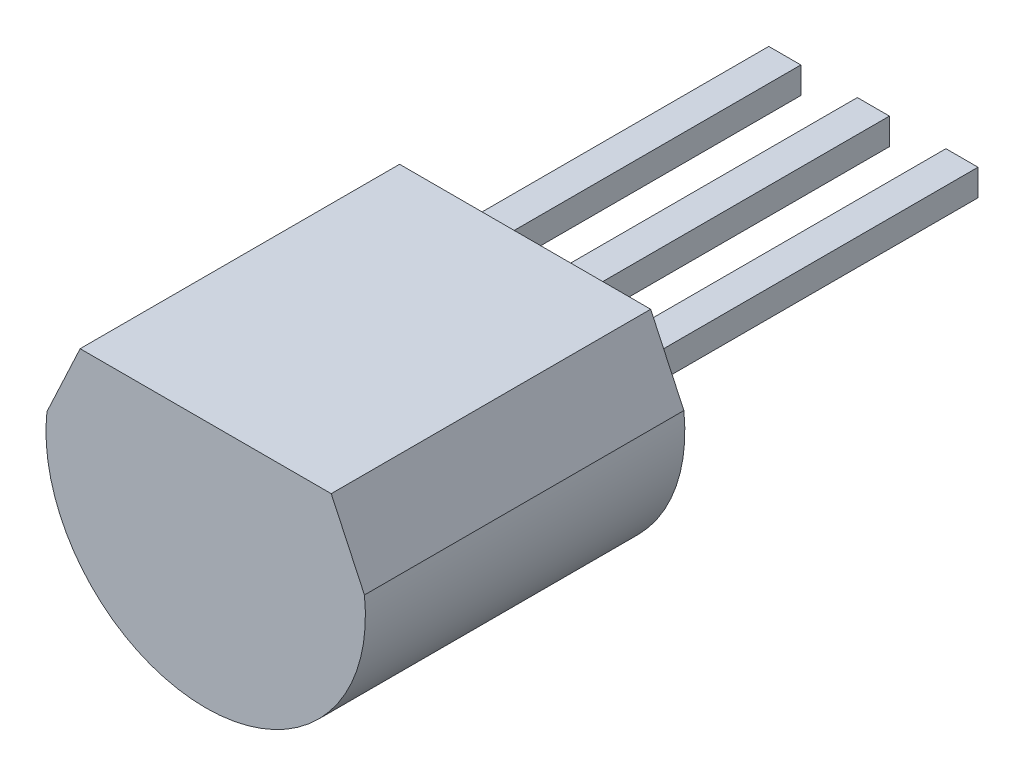
ISO-10303-21;
HEADER;
FILE_DESCRIPTION(('STEP AP214'),'2;1');
FILE_NAME('part.step','',(''),(''),'','','');
FILE_SCHEMA(('AUTOMOTIVE_DESIGN { 1 0 10303 214 1 1 1 1 }'));
ENDSEC;
DATA;
#1=APPLICATION_CONTEXT('core data for automotive mechanical design processes');
#2=APPLICATION_PROTOCOL_DEFINITION('international standard','automotive_design',2000,#1);
#3=PRODUCT_CONTEXT('',#1,'mechanical');
#4=PRODUCT('Part','Part','',(#3));
#5=PRODUCT_RELATED_PRODUCT_CATEGORY('part','',(#4));
#6=PRODUCT_DEFINITION_FORMATION('','',#4);
#7=PRODUCT_DEFINITION_CONTEXT('part definition',#1,'design');
#8=PRODUCT_DEFINITION('design','',#6,#7);
#9=PRODUCT_DEFINITION_SHAPE('','',#8);
#10=(LENGTH_UNIT() NAMED_UNIT(*) SI_UNIT(.MILLI.,.METRE.));
#11=(NAMED_UNIT(*) PLANE_ANGLE_UNIT() SI_UNIT($,.RADIAN.));
#12=(NAMED_UNIT(*) SI_UNIT($,.STERADIAN.) SOLID_ANGLE_UNIT());
#13=UNCERTAINTY_MEASURE_WITH_UNIT(LENGTH_MEASURE(1.E-05),#10,'distance_accuracy_value','');
#14=(GEOMETRIC_REPRESENTATION_CONTEXT(3) GLOBAL_UNCERTAINTY_ASSIGNED_CONTEXT((#13)) GLOBAL_UNIT_ASSIGNED_CONTEXT((#10,
#11,#12)) REPRESENTATION_CONTEXT('',''));
#15=CARTESIAN_POINT('',(0.,0.,0.));
#16=DIRECTION('',(0.,0.,1.));
#17=DIRECTION('',(1.,0.,0.));
#18=AXIS2_PLACEMENT_3D('',#15,#16,#17);
#19=CARTESIAN_POINT('',(0.,0.,4.58));
#20=DIRECTION('',(0.,0.,-1.));
#21=DIRECTION('',(-1.,0.,0.));
#22=AXIS2_PLACEMENT_3D('',#19,#20,#21);
#23=CYLINDRICAL_SURFACE('',#22,2.29);
#24=CARTESIAN_POINT('',(0.,0.,0.));
#25=DIRECTION('',(0.,0.,1.));
#26=DIRECTION('',(1.,0.,0.));
#27=AXIS2_PLACEMENT_3D('',#24,#25,#26);
#28=CIRCLE('',#27,2.29);
#29=CARTESIAN_POINT('',(-2.27631280802969,0.249999999999999,0.));
#30=VERTEX_POINT('',#29);
#31=CARTESIAN_POINT('',(2.27631280802969,0.25,0.));
#32=VERTEX_POINT('',#31);
#33=EDGE_CURVE('E259',#30,#32,#28,.T.);
#34=ORIENTED_EDGE('',*,*,#33,.T.);
#35=DIRECTION('',(0.,0.,-1.));
#36=VECTOR('',#35,1.);
#37=CARTESIAN_POINT('',(2.27631280802969,0.25,4.58));
#38=LINE('',#37,#36);
#39=CARTESIAN_POINT('',(2.27631280802969,0.25,4.58));
#40=VERTEX_POINT('',#39);
#41=EDGE_CURVE('E270',#40,#32,#38,.T.);
#42=ORIENTED_EDGE('',*,*,#41,.F.);
#43=CARTESIAN_POINT('',(0.,0.,4.58));
#44=DIRECTION('',(0.,0.,1.));
#45=DIRECTION('',(1.,0.,0.));
#46=AXIS2_PLACEMENT_3D('',#43,#44,#45);
#47=CIRCLE('',#46,2.29);
#48=CARTESIAN_POINT('',(-2.27631280802969,0.249999999999999,4.58));
#49=VERTEX_POINT('',#48);
#50=EDGE_CURVE('E247',#49,#40,#47,.T.);
#51=ORIENTED_EDGE('',*,*,#50,.F.);
#52=DIRECTION('',(0.,0.,-1.));
#53=VECTOR('',#52,1.);
#54=CARTESIAN_POINT('',(-2.27631280802969,0.249999999999999,4.58));
#55=LINE('',#54,#53);
#56=EDGE_CURVE('E46',#49,#30,#55,.T.);
#57=ORIENTED_EDGE('',*,*,#56,.T.);
#58=EDGE_LOOP('',(#34,#42,#51,#57));
#59=FACE_BOUND('',#58,.T.);
#60=CARTESIAN_POINT('',(0.,-2.29,1.62090682402154));
#61=CARTESIAN_POINT('',(0.0330975023179404,-2.28999948140746,1.62090765252265));
#62=CARTESIAN_POINT('',(0.0662039858905826,-2.28927537337162,1.62365462650305));
#63=CARTESIAN_POINT('',(0.131464637050143,-2.28645703985818,1.63455135152726));
#64=CARTESIAN_POINT('',(0.163618314571738,-2.28436212167969,1.64270383412264));
#65=CARTESIAN_POINT('',(0.226021796698901,-2.27903360778137,1.66412938002197));
#66=CARTESIAN_POINT('',(0.256273952267468,-2.27580145208567,1.67739596962239));
#67=CARTESIAN_POINT('',(0.314123739260772,-2.26854079665533,1.70864948722007));
#68=CARTESIAN_POINT('',(0.341721218210251,-2.26451225121942,1.72663668613152));
#69=CARTESIAN_POINT('',(0.394097829725334,-2.25599332271291,1.76724723631969));
#70=CARTESIAN_POINT('',(0.418808871599396,-2.2514952619971,1.78995679817719));
#71=CARTESIAN_POINT('',(0.464118822250609,-2.24259404374079,1.83918306077215));
#72=CARTESIAN_POINT('',(0.484717220830887,-2.23819089803541,1.86570023316479));
#73=CARTESIAN_POINT('',(0.521545803022261,-2.22989984201811,1.92232826555429));
#74=CARTESIAN_POINT('',(0.537698272364809,-2.22602163587792,1.95249121868668));
#75=CARTESIAN_POINT('',(0.564676155228551,-2.21933218837529,2.01522262807281));
#76=CARTESIAN_POINT('',(0.575502513337967,-2.21652075783996,2.04779065660614));
#77=CARTESIAN_POINT('',(0.591285570306814,-2.21236234868324,2.11365514294817));
#78=CARTESIAN_POINT('',(0.596365432745851,-2.21098469407197,2.14692010385428));
#79=CARTESIAN_POINT('',(0.600895183733747,-2.20975811935859,2.21385641456427));
#80=CARTESIAN_POINT('',(0.60034608497926,-2.20990892427391,2.24752769018006));
#81=CARTESIAN_POINT('',(0.593731418754882,-2.21169474042252,2.3133645081738));
#82=CARTESIAN_POINT('',(0.587814229338992,-2.21328982832024,2.34554621244983));
#83=CARTESIAN_POINT('',(0.570868723925989,-2.21772064514648,2.40844336972707));
#84=CARTESIAN_POINT('',(0.559840012062657,-2.22055647016398,2.43915870896112));
#85=CARTESIAN_POINT('',(0.532862047434301,-2.22718477786126,2.49864116845925));
#86=CARTESIAN_POINT('',(0.516860256013678,-2.23098739230707,2.52738328346402));
#87=CARTESIAN_POINT('',(0.480427042276187,-2.23911529607005,2.58182683207981));
#88=CARTESIAN_POINT('',(0.459994775391239,-2.24344068497243,2.60752768449829));
#89=CARTESIAN_POINT('',(0.414519107364714,-2.25229350521695,2.65600763973622));
#90=CARTESIAN_POINT('',(0.389350928758984,-2.2568230132373,2.67866947791652));
#91=CARTESIAN_POINT('',(0.335516376401778,-2.26545156820925,2.71947433796078));
#92=CARTESIAN_POINT('',(0.306849874125196,-2.26955059933525,2.73761719372708));
#93=CARTESIAN_POINT('',(0.246654899784228,-2.27688014033064,2.76891824032964));
#94=CARTESIAN_POINT('',(0.215115248743747,-2.28010704549129,2.78205583207798));
#95=CARTESIAN_POINT('',(0.150171298595141,-2.28530265564173,2.80280888156858));
#96=CARTESIAN_POINT('',(0.116767393983039,-2.28727162573459,2.8104255028713));
#97=CARTESIAN_POINT('',(0.0500444306683029,-2.28968966995334,2.81973772244365));
#98=CARTESIAN_POINT('',(0.0167490831546127,-2.29017967705413,2.8215928243885));
#99=CARTESIAN_POINT('',(-0.0496767829065809,-2.28970195532964,2.81976897468164));
#100=CARTESIAN_POINT('',(-0.0828073175285915,-2.28873437157793,2.81609057377781));
#101=CARTESIAN_POINT('',(-0.147398100625419,-2.28547656809237,2.80343515824928));
#102=CARTESIAN_POINT('',(-0.178876887011537,-2.28320843053068,2.79454655320458));
#103=CARTESIAN_POINT('',(-0.239893936814223,-2.27760629903843,2.77182522903229));
#104=CARTESIAN_POINT('',(-0.269431993380646,-2.27427219171432,2.75799198389542));
#105=CARTESIAN_POINT('',(-0.326353126142149,-2.26681142532615,2.72547442681036));
#106=CARTESIAN_POINT('',(-0.353684345322917,-2.26267086082751,2.70670260988338));
#107=CARTESIAN_POINT('',(-0.40486498635958,-2.25407607828748,2.66495129947086));
#108=CARTESIAN_POINT('',(-0.428713743655181,-2.24962180061978,2.6419710047601));
#109=CARTESIAN_POINT('',(-0.472920419527273,-2.24075193147354,2.59171171399555));
#110=CARTESIAN_POINT('',(-0.493165974764859,-2.23634067411957,2.56433294264012));
#111=CARTESIAN_POINT('',(-0.528777008579864,-2.22818982070887,2.50647397946217));
#112=CARTESIAN_POINT('',(-0.544142695775825,-2.22445019594225,2.47599392029595));
#113=CARTESIAN_POINT('',(-0.569442167718115,-2.21810861000545,2.41295370780964));
#114=CARTESIAN_POINT('',(-0.579407731184882,-2.21550001152819,2.38040701146252));
#115=CARTESIAN_POINT('',(-0.593701962572269,-2.21171284209218,2.31402026788187));
#116=CARTESIAN_POINT('',(-0.598032010586037,-2.21053392102156,2.28018053939202));
#117=CARTESIAN_POINT('',(-0.600854951654086,-2.2097681130648,2.21331665694947));
#118=CARTESIAN_POINT('',(-0.599528144780679,-2.21013204880956,2.18030056225179));
#119=CARTESIAN_POINT('',(-0.5914916777254,-2.21229621930244,2.11498055560863));
#120=CARTESIAN_POINT('',(-0.584782147082776,-2.21409641948578,2.08267662654358));
#121=CARTESIAN_POINT('',(-0.5662735320344,-2.21890153260919,2.01991604014583));
#122=CARTESIAN_POINT('',(-0.554511401451611,-2.22189768749868,1.98944776743062));
#123=CARTESIAN_POINT('',(-0.52626028637817,-2.22875760801448,1.93089434840107));
#124=CARTESIAN_POINT('',(-0.509770584233331,-2.23262150534642,1.90280956474434));
#125=CARTESIAN_POINT('',(-0.471980614788332,-2.2409190185835,1.84895666854931));
#126=CARTESIAN_POINT('',(-0.450556715572077,-2.24536572620597,1.82327731667711));
#127=CARTESIAN_POINT('',(-0.403743283365995,-2.2542533144814,1.77581958659294));
#128=CARTESIAN_POINT('',(-0.378352794457848,-2.25869419346889,1.75404215143669));
#129=CARTESIAN_POINT('',(-0.323700796482316,-2.26717821173752,1.71456996756139));
#130=CARTESIAN_POINT('',(-0.294370787761282,-2.27121136912249,1.69696773931732));
#131=CARTESIAN_POINT('',(-0.233063712672143,-2.27831749136788,1.66697168156432));
#132=CARTESIAN_POINT('',(-0.201088419000533,-2.28139109277109,1.65457439734946));
#133=CARTESIAN_POINT('',(-0.141011367797884,-2.28581795268001,1.63702132472103));
#134=CARTESIAN_POINT('',(-0.113176640303292,-2.2873749815978,1.63099213965557));
#135=CARTESIAN_POINT('',(-0.0568967834025167,-2.28946618132238,1.62293471639974));
#136=CARTESIAN_POINT('',(-0.0284517101363374,-2.29000044579933,1.62090611181453));
#137=CARTESIAN_POINT('',(0.,-2.29,1.62090682402154));
#138=B_SPLINE_CURVE_WITH_KNOTS('',3,(#60,#61,#62,#63,#64,#65,#66,#67,#68,#69,#70,#71,#72,#73,
#74,#75,#76,#77,#78,#79,#80,#81,#82,#83,#84,#85,#86,#87,#88,#89,#90,#91,#92,#93,#94,#95,#96,#97,
#98,#99,#100,#101,#102,#103,#104,#105,#106,#107,#108,#109,#110,#111,#112,#113,#114,#115,#116,
#117,#118,#119,#120,#121,#122,#123,#124,#125,#126,#127,#128,#129,#130,#131,#132,#133,#134,#135,
#136,#137),.UNSPECIFIED.,.T.,.F.,(4,2,2,2,2,2,2,2,2,2,2,2,2,2,2,2,2,2,2,2,2,2,2,2,2,2,2,2,2,2,2,
2,2,2,2,2,2,2,4),(0.,0.0991881887198287,0.198426538187172,0.297539676910804,0.396658504948574,
0.497776993180304,0.59890801795395,0.701708321820208,0.804490387427924,0.905025136005533,
1.00554179786822,1.1033620339432,1.20118984705608,1.30008847962859,1.39900598154702,
1.50103345446978,1.60306467691455,1.70551138445841,1.80793649478011,1.90749954635346,
2.00705268910153,2.1049635538176,2.20288483736249,2.30267406414397,2.40248230894692,
2.50500050634471,2.60751432041148,2.70941812094822,2.81129696135183,2.90995332115767,
3.00860730679612,3.10655172155596,3.20451101234037,3.30526023406536,3.40603377315727,
3.50886655376676,3.61163097229573,3.69690423744294,3.78216969243998),.UNSPECIFIED.);
#139=CARTESIAN_POINT('',(0.,-2.29,1.62090682402154));
#140=VERTEX_POINT('',#139);
#141=EDGE_CURVE('E11',#140,#140,#138,.T.);
#142=ORIENTED_EDGE('',*,*,#141,.F.);
#143=EDGE_LOOP('',(#142));
#144=FACE_BOUND('',#143,.T.);
#145=ADVANCED_FACE('F35',(#59,#144),#23,.T.);
#146=CARTESIAN_POINT('',(0.,-5.16343310267592,0.));
#147=DIRECTION('',(0.,0.,1.));
#148=DIRECTION('',(1.,0.,0.));
#149=AXIS2_PLACEMENT_3D('',#146,#147,#148);
#150=PLANE('',#149);
#151=DIRECTION('',(-1.,0.,0.));
#152=VECTOR('',#151,1.);
#153=CARTESIAN_POINT('',(1.49328132172173,0.,0.));
#154=LINE('',#153,#152);
#155=CARTESIAN_POINT('',(1.49328132172173,0.,0.));
#156=VERTEX_POINT('',#155);
#157=CARTESIAN_POINT('',(1.03328132171853,0.,0.));
#158=VERTEX_POINT('',#157);
#159=EDGE_CURVE('E172',#156,#158,#154,.T.);
#160=ORIENTED_EDGE('',*,*,#159,.F.);
#161=DIRECTION('',(4.21640518552389E-12,-1.,0.));
#162=VECTOR('',#161,1.);
#163=CARTESIAN_POINT('',(1.49328132172013,0.379999999999991,0.));
#164=LINE('',#163,#162);
#165=CARTESIAN_POINT('',(1.49328132172013,0.379999999999991,0.));
#166=VERTEX_POINT('',#165);
#167=EDGE_CURVE('E185',#166,#156,#164,.T.);
#168=ORIENTED_EDGE('',*,*,#167,.F.);
#169=DIRECTION('',(1.,0.,0.));
#170=VECTOR('',#169,1.);
#171=CARTESIAN_POINT('',(1.49328132172013,0.379999999999991,0.));
#172=LINE('',#171,#170);
#173=CARTESIAN_POINT('',(1.03328132172013,0.379999999999991,0.));
#174=VERTEX_POINT('',#173);
#175=EDGE_CURVE('E194',#174,#166,#172,.T.);
#176=ORIENTED_EDGE('',*,*,#175,.F.);
#177=DIRECTION('',(4.21640518552389E-12,1.,0.));
#178=VECTOR('',#177,1.);
#179=CARTESIAN_POINT('',(1.03328132172013,0.379999999999991,0.));
#180=LINE('',#179,#178);
#181=EDGE_CURVE('E175',#158,#174,#180,.T.);
#182=ORIENTED_EDGE('',*,*,#181,.F.);
#183=EDGE_LOOP('',(#160,#168,#176,#182));
#184=FACE_BOUND('',#183,.T.);
#185=DIRECTION('',(-0.423113630363178,-0.90607662799616,0.));
#186=VECTOR('',#185,1.);
#187=CARTESIAN_POINT('',(-3.9441616790688,-3.32161474514822,0.));
#188=LINE('',#187,#186);
#189=CARTESIAN_POINT('',(-1.80000000000053,1.27,0.));
#190=VERTEX_POINT('',#189);
#191=EDGE_CURVE('E243',#190,#30,#188,.T.);
#192=ORIENTED_EDGE('',*,*,#191,.F.);
#193=DIRECTION('',(1.,0.,0.));
#194=VECTOR('',#193,1.);
#195=CARTESIAN_POINT('',(0.,1.27,0.));
#196=LINE('',#195,#194);
#197=CARTESIAN_POINT('',(1.80000000000052,1.27,0.));
#198=VERTEX_POINT('',#197);
#199=EDGE_CURVE('E248',#190,#198,#196,.T.);
#200=ORIENTED_EDGE('',*,*,#199,.T.);
#201=DIRECTION('',(0.423113630363184,-0.906076627996157,0.));
#202=VECTOR('',#201,1.);
#203=CARTESIAN_POINT('',(3.94416167906881,-3.32161474514818,0.));
#204=LINE('',#203,#202);
#205=EDGE_CURVE('E262',#198,#32,#204,.T.);
#206=ORIENTED_EDGE('',*,*,#205,.T.);
#207=ORIENTED_EDGE('',*,*,#33,.F.);
#208=EDGE_LOOP('',(#192,#200,#206,#207));
#209=FACE_BOUND('',#208,.T.);
#210=DIRECTION('',(-1.,0.,0.));
#211=VECTOR('',#210,1.);
#212=CARTESIAN_POINT('',(0.223281321721731,0.,0.));
#213=LINE('',#212,#211);
#214=CARTESIAN_POINT('',(0.223281321721731,0.,0.));
#215=VERTEX_POINT('',#214);
#216=CARTESIAN_POINT('',(-0.236718678281474,0.,0.));
#217=VERTEX_POINT('',#216);
#218=EDGE_CURVE('E210',#215,#217,#213,.T.);
#219=ORIENTED_EDGE('',*,*,#218,.F.);
#220=DIRECTION('',(4.21640518552389E-12,-1.,0.));
#221=VECTOR('',#220,1.);
#222=CARTESIAN_POINT('',(0.223281321720128,0.38,0.));
#223=LINE('',#222,#221);
#224=CARTESIAN_POINT('',(0.223281321720128,0.38,0.));
#225=VERTEX_POINT('',#224);
#226=EDGE_CURVE('E215',#225,#215,#223,.T.);
#227=ORIENTED_EDGE('',*,*,#226,.F.);
#228=DIRECTION('',(1.,0.,0.));
#229=VECTOR('',#228,1.);
#230=CARTESIAN_POINT('',(0.223281321720128,0.38,0.));
#231=LINE('',#230,#229);
#232=CARTESIAN_POINT('',(-0.236718678279872,0.38,0.));
#233=VERTEX_POINT('',#232);
#234=EDGE_CURVE('E227',#233,#225,#231,.T.);
#235=ORIENTED_EDGE('',*,*,#234,.F.);
#236=DIRECTION('',(4.21640518552389E-12,1.,0.));
#237=VECTOR('',#236,1.);
#238=CARTESIAN_POINT('',(-0.236718678279872,0.38,0.));
#239=LINE('',#238,#237);
#240=EDGE_CURVE('E224',#217,#233,#239,.T.);
#241=ORIENTED_EDGE('',*,*,#240,.F.);
#242=EDGE_LOOP('',(#219,#227,#235,#241));
#243=FACE_BOUND('',#242,.T.);
#244=DIRECTION('',(-1.,0.,0.));
#245=VECTOR('',#244,1.);
#246=CARTESIAN_POINT('',(-1.04671867827827,0.,0.));
#247=LINE('',#246,#245);
#248=CARTESIAN_POINT('',(-1.04671867827827,0.,0.));
#249=VERTEX_POINT('',#248);
#250=CARTESIAN_POINT('',(-1.50671867828147,0.,0.));
#251=VERTEX_POINT('',#250);
#252=EDGE_CURVE('E171',#249,#251,#247,.T.);
#253=ORIENTED_EDGE('',*,*,#252,.F.);
#254=DIRECTION('',(4.21640518552389E-12,-1.,0.));
#255=VECTOR('',#254,1.);
#256=CARTESIAN_POINT('',(-1.04671867827987,0.38,0.));
#257=LINE('',#256,#255);
#258=CARTESIAN_POINT('',(-1.04671867827987,0.38,0.));
#259=VERTEX_POINT('',#258);
#260=EDGE_CURVE('E168',#259,#249,#257,.T.);
#261=ORIENTED_EDGE('',*,*,#260,.F.);
#262=DIRECTION('',(1.,0.,0.));
#263=VECTOR('',#262,1.);
#264=CARTESIAN_POINT('',(-1.04671867827987,0.38,0.));
#265=LINE('',#264,#263);
#266=CARTESIAN_POINT('',(-1.50671867827987,0.38,0.));
#267=VERTEX_POINT('',#266);
#268=EDGE_CURVE('E58',#267,#259,#265,.T.);
#269=ORIENTED_EDGE('',*,*,#268,.F.);
#270=DIRECTION('',(4.21640518552389E-12,1.,0.));
#271=VECTOR('',#270,1.);
#272=CARTESIAN_POINT('',(-1.50671867827987,0.38,0.));
#273=LINE('',#272,#271);
#274=EDGE_CURVE('E53',#251,#267,#273,.T.);
#275=ORIENTED_EDGE('',*,*,#274,.F.);
#276=EDGE_LOOP('',(#253,#261,#269,#275));
#277=FACE_BOUND('',#276,.T.);
#278=ADVANCED_FACE('F281',(#184,#209,#243,#277),#150,.F.);
#279=CARTESIAN_POINT('',(-3.9441616790688,-3.32161474514822,4.58));
#280=DIRECTION('',(0.90607662799616,-0.423113630363178,0.));
#281=DIRECTION('',(0.423113630363178,0.90607662799616,0.));
#282=AXIS2_PLACEMENT_3D('',#279,#280,#281);
#283=PLANE('',#282);
#284=ORIENTED_EDGE('',*,*,#191,.T.);
#285=ORIENTED_EDGE('',*,*,#56,.F.);
#286=DIRECTION('',(-0.423113630363178,-0.90607662799616,0.));
#287=VECTOR('',#286,1.);
#288=CARTESIAN_POINT('',(-3.9441616790688,-3.32161474514822,4.58));
#289=LINE('',#288,#287);
#290=CARTESIAN_POINT('',(-1.80000000000053,1.27,4.58));
#291=VERTEX_POINT('',#290);
#292=EDGE_CURVE('E244',#291,#49,#289,.T.);
#293=ORIENTED_EDGE('',*,*,#292,.F.);
#294=DIRECTION('',(0.,0.,-1.));
#295=VECTOR('',#294,1.);
#296=CARTESIAN_POINT('',(-1.80000000000053,1.27,4.58));
#297=LINE('',#296,#295);
#298=EDGE_CURVE('E256',#291,#190,#297,.T.);
#299=ORIENTED_EDGE('',*,*,#298,.T.);
#300=EDGE_LOOP('',(#284,#285,#293,#299));
#301=FACE_BOUND('',#300,.T.);
#302=ADVANCED_FACE('F37',(#301),#283,.F.);
#303=CARTESIAN_POINT('',(3.94416167906881,-3.32161474514818,4.58));
#304=DIRECTION('',(0.906076627996157,0.423113630363184,0.));
#305=DIRECTION('',(-0.423113630363184,0.906076627996158,0.));
#306=AXIS2_PLACEMENT_3D('',#303,#304,#305);
#307=PLANE('',#306);
#308=ORIENTED_EDGE('',*,*,#205,.F.);
#309=DIRECTION('',(0.,0.,-1.));
#310=VECTOR('',#309,1.);
#311=CARTESIAN_POINT('',(1.80000000000052,1.27,4.58));
#312=LINE('',#311,#310);
#313=CARTESIAN_POINT('',(1.80000000000052,1.27,4.58));
#314=VERTEX_POINT('',#313);
#315=EDGE_CURVE('E268',#314,#198,#312,.T.);
#316=ORIENTED_EDGE('',*,*,#315,.F.);
#317=DIRECTION('',(0.423113630363184,-0.906076627996157,0.));
#318=VECTOR('',#317,1.);
#319=CARTESIAN_POINT('',(3.94416167906881,-3.32161474514818,4.58));
#320=LINE('',#319,#318);
#321=EDGE_CURVE('E250',#314,#40,#320,.T.);
#322=ORIENTED_EDGE('',*,*,#321,.T.);
#323=ORIENTED_EDGE('',*,*,#41,.T.);
#324=EDGE_LOOP('',(#308,#316,#322,#323));
#325=FACE_BOUND('',#324,.T.);
#326=ADVANCED_FACE('F289',(#325),#307,.T.);
#327=CARTESIAN_POINT('',(0.,1.27,4.58));
#328=DIRECTION('',(0.,1.,0.));
#329=DIRECTION('',(0.,0.,1.));
#330=AXIS2_PLACEMENT_3D('',#327,#328,#329);
#331=PLANE('',#330);
#332=ORIENTED_EDGE('',*,*,#199,.F.);
#333=ORIENTED_EDGE('',*,*,#298,.F.);
#334=DIRECTION('',(1.,0.,0.));
#335=VECTOR('',#334,1.);
#336=CARTESIAN_POINT('',(0.,1.27,4.58));
#337=LINE('',#336,#335);
#338=EDGE_CURVE('E253',#291,#314,#337,.T.);
#339=ORIENTED_EDGE('',*,*,#338,.T.);
#340=ORIENTED_EDGE('',*,*,#315,.T.);
#341=EDGE_LOOP('',(#332,#333,#339,#340));
#342=FACE_BOUND('',#341,.T.);
#343=ADVANCED_FACE('F284',(#342),#331,.T.);
#344=CARTESIAN_POINT('',(0.,-5.16343310267592,4.58));
#345=DIRECTION('',(0.,0.,1.));
#346=DIRECTION('',(1.,0.,0.));
#347=AXIS2_PLACEMENT_3D('',#344,#345,#346);
#348=PLANE('',#347);
#349=ORIENTED_EDGE('',*,*,#292,.T.);
#350=ORIENTED_EDGE('',*,*,#50,.T.);
#351=ORIENTED_EDGE('',*,*,#321,.F.);
#352=ORIENTED_EDGE('',*,*,#338,.F.);
#353=EDGE_LOOP('',(#349,#350,#351,#352));
#354=FACE_BOUND('',#353,.T.);
#355=ADVANCED_FACE('F291',(#354),#348,.T.);
#356=CARTESIAN_POINT('',(0.223281321721731,0.,-5.));
#357=DIRECTION('',(0.,1.,0.));
#358=DIRECTION('',(0.,0.,1.));
#359=AXIS2_PLACEMENT_3D('',#356,#357,#358);
#360=PLANE('',#359);
#361=ORIENTED_EDGE('',*,*,#218,.T.);
#362=DIRECTION('',(0.,0.,1.));
#363=VECTOR('',#362,1.);
#364=CARTESIAN_POINT('',(-0.236718678281474,0.,-5.));
#365=LINE('',#364,#363);
#366=CARTESIAN_POINT('',(-0.236718678281474,0.,-5.));
#367=VERTEX_POINT('',#366);
#368=EDGE_CURVE('E240',#367,#217,#365,.T.);
#369=ORIENTED_EDGE('',*,*,#368,.F.);
#370=DIRECTION('',(-1.,0.,0.));
#371=VECTOR('',#370,1.);
#372=CARTESIAN_POINT('',(0.223281321721731,0.,-5.));
#373=LINE('',#372,#371);
#374=CARTESIAN_POINT('',(0.223281321721731,0.,-5.));
#375=VERTEX_POINT('',#374);
#376=EDGE_CURVE('E211',#375,#367,#373,.T.);
#377=ORIENTED_EDGE('',*,*,#376,.F.);
#378=DIRECTION('',(0.,0.,1.));
#379=VECTOR('',#378,1.);
#380=CARTESIAN_POINT('',(0.223281321721731,0.,-5.));
#381=LINE('',#380,#379);
#382=EDGE_CURVE('E221',#375,#215,#381,.T.);
#383=ORIENTED_EDGE('',*,*,#382,.T.);
#384=EDGE_LOOP('',(#361,#369,#377,#383));
#385=FACE_BOUND('',#384,.T.);
#386=ADVANCED_FACE('F293',(#385),#360,.F.);
#387=CARTESIAN_POINT('',(-0.236718678279872,0.38,-5.));
#388=DIRECTION('',(1.,-4.21640518552389E-12,0.));
#389=DIRECTION('',(4.21640518552389E-12,1.,0.));
#390=AXIS2_PLACEMENT_3D('',#387,#388,#389);
#391=PLANE('',#390);
#392=ORIENTED_EDGE('',*,*,#240,.T.);
#393=DIRECTION('',(0.,0.,1.));
#394=VECTOR('',#393,1.);
#395=CARTESIAN_POINT('',(-0.236718678279872,0.38,-5.));
#396=LINE('',#395,#394);
#397=CARTESIAN_POINT('',(-0.236718678279872,0.38,-5.));
#398=VERTEX_POINT('',#397);
#399=EDGE_CURVE('E237',#398,#233,#396,.T.);
#400=ORIENTED_EDGE('',*,*,#399,.F.);
#401=DIRECTION('',(4.21640518552389E-12,1.,0.));
#402=VECTOR('',#401,1.);
#403=CARTESIAN_POINT('',(-0.236718678279872,0.38,-5.));
#404=LINE('',#403,#402);
#405=EDGE_CURVE('E214',#367,#398,#404,.T.);
#406=ORIENTED_EDGE('',*,*,#405,.F.);
#407=ORIENTED_EDGE('',*,*,#368,.T.);
#408=EDGE_LOOP('',(#392,#400,#406,#407));
#409=FACE_BOUND('',#408,.T.);
#410=ADVANCED_FACE('F299',(#409),#391,.F.);
#411=CARTESIAN_POINT('',(0.223281321720128,0.38,-5.));
#412=DIRECTION('',(0.,-1.,0.));
#413=DIRECTION('',(0.,0.,-1.));
#414=AXIS2_PLACEMENT_3D('',#411,#412,#413);
#415=PLANE('',#414);
#416=ORIENTED_EDGE('',*,*,#234,.T.);
#417=DIRECTION('',(0.,0.,1.));
#418=VECTOR('',#417,1.);
#419=CARTESIAN_POINT('',(0.223281321720128,0.38,-5.));
#420=LINE('',#419,#418);
#421=CARTESIAN_POINT('',(0.223281321720128,0.38,-5.));
#422=VERTEX_POINT('',#421);
#423=EDGE_CURVE('E234',#422,#225,#420,.T.);
#424=ORIENTED_EDGE('',*,*,#423,.F.);
#425=DIRECTION('',(1.,0.,0.));
#426=VECTOR('',#425,1.);
#427=CARTESIAN_POINT('',(0.223281321720128,0.38,-5.));
#428=LINE('',#427,#426);
#429=EDGE_CURVE('E217',#398,#422,#428,.T.);
#430=ORIENTED_EDGE('',*,*,#429,.F.);
#431=ORIENTED_EDGE('',*,*,#399,.T.);
#432=EDGE_LOOP('',(#416,#424,#430,#431));
#433=FACE_BOUND('',#432,.T.);
#434=ADVANCED_FACE('F340',(#433),#415,.F.);
#435=CARTESIAN_POINT('',(0.223281321720128,0.38,-5.));
#436=DIRECTION('',(-1.,-4.21640518552389E-12,0.));
#437=DIRECTION('',(4.21640518552389E-12,-1.,0.));
#438=AXIS2_PLACEMENT_3D('',#435,#436,#437);
#439=PLANE('',#438);
#440=ORIENTED_EDGE('',*,*,#226,.T.);
#441=ORIENTED_EDGE('',*,*,#382,.F.);
#442=DIRECTION('',(4.21640518552389E-12,-1.,0.));
#443=VECTOR('',#442,1.);
#444=CARTESIAN_POINT('',(0.223281321720128,0.38,-5.));
#445=LINE('',#444,#443);
#446=EDGE_CURVE('E219',#422,#375,#445,.T.);
#447=ORIENTED_EDGE('',*,*,#446,.F.);
#448=ORIENTED_EDGE('',*,*,#423,.T.);
#449=EDGE_LOOP('',(#440,#441,#447,#448));
#450=FACE_BOUND('',#449,.T.);
#451=ADVANCED_FACE('F350',(#450),#439,.F.);
#452=CARTESIAN_POINT('',(-0.236718678281474,0.,-5.));
#453=DIRECTION('',(0.,0.,1.));
#454=DIRECTION('',(1.,0.,0.));
#455=AXIS2_PLACEMENT_3D('',#452,#453,#454);
#456=PLANE('',#455);
#457=ORIENTED_EDGE('',*,*,#376,.T.);
#458=ORIENTED_EDGE('',*,*,#405,.T.);
#459=ORIENTED_EDGE('',*,*,#429,.T.);
#460=ORIENTED_EDGE('',*,*,#446,.T.);
#461=EDGE_LOOP('',(#457,#458,#459,#460));
#462=FACE_BOUND('',#461,.T.);
#463=ADVANCED_FACE('F360',(#462),#456,.F.);
#464=CARTESIAN_POINT('',(1.49328132172173,0.,-5.));
#465=DIRECTION('',(0.,1.,0.));
#466=DIRECTION('',(0.,0.,1.));
#467=AXIS2_PLACEMENT_3D('',#464,#465,#466);
#468=PLANE('',#467);
#469=ORIENTED_EDGE('',*,*,#159,.T.);
#470=DIRECTION('',(0.,0.,1.));
#471=VECTOR('',#470,1.);
#472=CARTESIAN_POINT('',(1.03328132171853,0.,-5.));
#473=LINE('',#472,#471);
#474=CARTESIAN_POINT('',(1.03328132171853,0.,-5.));
#475=VERTEX_POINT('',#474);
#476=EDGE_CURVE('E207',#475,#158,#473,.T.);
#477=ORIENTED_EDGE('',*,*,#476,.F.);
#478=DIRECTION('',(-1.,0.,0.));
#479=VECTOR('',#478,1.);
#480=CARTESIAN_POINT('',(1.49328132172173,0.,-5.));
#481=LINE('',#480,#479);
#482=CARTESIAN_POINT('',(1.49328132172173,0.,-5.));
#483=VERTEX_POINT('',#482);
#484=EDGE_CURVE('E181',#483,#475,#481,.T.);
#485=ORIENTED_EDGE('',*,*,#484,.F.);
#486=DIRECTION('',(0.,0.,1.));
#487=VECTOR('',#486,1.);
#488=CARTESIAN_POINT('',(1.49328132172173,0.,-5.));
#489=LINE('',#488,#487);
#490=EDGE_CURVE('E190',#483,#156,#489,.T.);
#491=ORIENTED_EDGE('',*,*,#490,.T.);
#492=EDGE_LOOP('',(#469,#477,#485,#491));
#493=FACE_BOUND('',#492,.T.);
#494=ADVANCED_FACE('F370',(#493),#468,.F.);
#495=CARTESIAN_POINT('',(1.03328132172013,0.379999999999991,-5.));
#496=DIRECTION('',(1.,-4.21640518552389E-12,0.));
#497=DIRECTION('',(4.21640518552389E-12,1.,0.));
#498=AXIS2_PLACEMENT_3D('',#495,#496,#497);
#499=PLANE('',#498);
#500=ORIENTED_EDGE('',*,*,#181,.T.);
#501=DIRECTION('',(0.,0.,1.));
#502=VECTOR('',#501,1.);
#503=CARTESIAN_POINT('',(1.03328132172013,0.379999999999991,-5.));
#504=LINE('',#503,#502);
#505=CARTESIAN_POINT('',(1.03328132172013,0.379999999999991,-5.));
#506=VERTEX_POINT('',#505);
#507=EDGE_CURVE('E204',#506,#174,#504,.T.);
#508=ORIENTED_EDGE('',*,*,#507,.F.);
#509=DIRECTION('',(4.21640518552389E-12,1.,0.));
#510=VECTOR('',#509,1.);
#511=CARTESIAN_POINT('',(1.03328132172013,0.379999999999991,-5.));
#512=LINE('',#511,#510);
#513=EDGE_CURVE('E184',#475,#506,#512,.T.);
#514=ORIENTED_EDGE('',*,*,#513,.F.);
#515=ORIENTED_EDGE('',*,*,#476,.T.);
#516=EDGE_LOOP('',(#500,#508,#514,#515));
#517=FACE_BOUND('',#516,.T.);
#518=ADVANCED_FACE('F380',(#517),#499,.F.);
#519=CARTESIAN_POINT('',(1.49328132172013,0.379999999999991,-5.));
#520=DIRECTION('',(0.,-1.,0.));
#521=DIRECTION('',(0.,0.,-1.));
#522=AXIS2_PLACEMENT_3D('',#519,#520,#521);
#523=PLANE('',#522);
#524=ORIENTED_EDGE('',*,*,#175,.T.);
#525=DIRECTION('',(0.,0.,1.));
#526=VECTOR('',#525,1.);
#527=CARTESIAN_POINT('',(1.49328132172013,0.379999999999991,-5.));
#528=LINE('',#527,#526);
#529=CARTESIAN_POINT('',(1.49328132172013,0.379999999999991,-5.));
#530=VERTEX_POINT('',#529);
#531=EDGE_CURVE('E201',#530,#166,#528,.T.);
#532=ORIENTED_EDGE('',*,*,#531,.F.);
#533=DIRECTION('',(1.,0.,0.));
#534=VECTOR('',#533,1.);
#535=CARTESIAN_POINT('',(1.49328132172013,0.379999999999991,-5.));
#536=LINE('',#535,#534);
#537=EDGE_CURVE('E187',#506,#530,#536,.T.);
#538=ORIENTED_EDGE('',*,*,#537,.F.);
#539=ORIENTED_EDGE('',*,*,#507,.T.);
#540=EDGE_LOOP('',(#524,#532,#538,#539));
#541=FACE_BOUND('',#540,.T.);
#542=ADVANCED_FACE('F390',(#541),#523,.F.);
#543=CARTESIAN_POINT('',(1.49328132172013,0.379999999999991,-5.));
#544=DIRECTION('',(-1.,-4.21640518552389E-12,0.));
#545=DIRECTION('',(4.21640518552389E-12,-1.,0.));
#546=AXIS2_PLACEMENT_3D('',#543,#544,#545);
#547=PLANE('',#546);
#548=ORIENTED_EDGE('',*,*,#167,.T.);
#549=ORIENTED_EDGE('',*,*,#490,.F.);
#550=DIRECTION('',(4.21640518552389E-12,-1.,0.));
#551=VECTOR('',#550,1.);
#552=CARTESIAN_POINT('',(1.49328132172013,0.379999999999991,-5.));
#553=LINE('',#552,#551);
#554=EDGE_CURVE('E189',#530,#483,#553,.T.);
#555=ORIENTED_EDGE('',*,*,#554,.F.);
#556=ORIENTED_EDGE('',*,*,#531,.T.);
#557=EDGE_LOOP('',(#548,#549,#555,#556));
#558=FACE_BOUND('',#557,.T.);
#559=ADVANCED_FACE('F400',(#558),#547,.F.);
#560=CARTESIAN_POINT('',(1.03328132171853,0.,-5.));
#561=DIRECTION('',(0.,0.,1.));
#562=DIRECTION('',(1.,0.,0.));
#563=AXIS2_PLACEMENT_3D('',#560,#561,#562);
#564=PLANE('',#563);
#565=ORIENTED_EDGE('',*,*,#484,.T.);
#566=ORIENTED_EDGE('',*,*,#513,.T.);
#567=ORIENTED_EDGE('',*,*,#537,.T.);
#568=ORIENTED_EDGE('',*,*,#554,.T.);
#569=EDGE_LOOP('',(#565,#566,#567,#568));
#570=FACE_BOUND('',#569,.T.);
#571=ADVANCED_FACE('F410',(#570),#564,.F.);
#572=CARTESIAN_POINT('',(-1.04671867827827,0.,-5.));
#573=DIRECTION('',(0.,1.,0.));
#574=DIRECTION('',(0.,0.,1.));
#575=AXIS2_PLACEMENT_3D('',#572,#573,#574);
#576=PLANE('',#575);
#577=ORIENTED_EDGE('',*,*,#252,.T.);
#578=DIRECTION('',(0.,0.,1.));
#579=VECTOR('',#578,1.);
#580=CARTESIAN_POINT('',(-1.50671867828147,0.,-5.));
#581=LINE('',#580,#579);
#582=CARTESIAN_POINT('',(-1.50671867828147,0.,-5.));
#583=VERTEX_POINT('',#582);
#584=EDGE_CURVE('E152',#583,#251,#581,.T.);
#585=ORIENTED_EDGE('',*,*,#584,.F.);
#586=DIRECTION('',(-1.,0.,0.));
#587=VECTOR('',#586,1.);
#588=CARTESIAN_POINT('',(-1.04671867827827,0.,-5.));
#589=LINE('',#588,#587);
#590=CARTESIAN_POINT('',(-1.04671867827827,0.,-5.));
#591=VERTEX_POINT('',#590);
#592=EDGE_CURVE('E159',#591,#583,#589,.T.);
#593=ORIENTED_EDGE('',*,*,#592,.F.);
#594=DIRECTION('',(0.,0.,1.));
#595=VECTOR('',#594,1.);
#596=CARTESIAN_POINT('',(-1.04671867827827,0.,-5.));
#597=LINE('',#596,#595);
#598=EDGE_CURVE('E499',#591,#249,#597,.T.);
#599=ORIENTED_EDGE('',*,*,#598,.T.);
#600=EDGE_LOOP('',(#577,#585,#593,#599));
#601=FACE_BOUND('',#600,.T.);
#602=ADVANCED_FACE('F170',(#601),#576,.F.);
#603=CARTESIAN_POINT('',(-1.50671867827987,0.38,-5.));
#604=DIRECTION('',(1.,-4.21640518552389E-12,0.));
#605=DIRECTION('',(4.21640518552389E-12,1.,0.));
#606=AXIS2_PLACEMENT_3D('',#603,#604,#605);
#607=PLANE('',#606);
#608=ORIENTED_EDGE('',*,*,#274,.T.);
#609=DIRECTION('',(0.,0.,1.));
#610=VECTOR('',#609,1.);
#611=CARTESIAN_POINT('',(-1.50671867827987,0.38,-5.));
#612=LINE('',#611,#610);
#613=CARTESIAN_POINT('',(-1.50671867827987,0.38,-5.));
#614=VERTEX_POINT('',#613);
#615=EDGE_CURVE('E155',#614,#267,#612,.T.);
#616=ORIENTED_EDGE('',*,*,#615,.F.);
#617=DIRECTION('',(4.21640518552389E-12,1.,0.));
#618=VECTOR('',#617,1.);
#619=CARTESIAN_POINT('',(-1.50671867827987,0.38,-5.));
#620=LINE('',#619,#618);
#621=EDGE_CURVE('E148',#583,#614,#620,.T.);
#622=ORIENTED_EDGE('',*,*,#621,.F.);
#623=ORIENTED_EDGE('',*,*,#584,.T.);
#624=EDGE_LOOP('',(#608,#616,#622,#623));
#625=FACE_BOUND('',#624,.T.);
#626=ADVANCED_FACE('F150',(#625),#607,.F.);
#627=CARTESIAN_POINT('',(-1.04671867827987,0.38,-5.));
#628=DIRECTION('',(0.,-1.,0.));
#629=DIRECTION('',(0.,0.,-1.));
#630=AXIS2_PLACEMENT_3D('',#627,#628,#629);
#631=PLANE('',#630);
#632=ORIENTED_EDGE('',*,*,#268,.T.);
#633=DIRECTION('',(0.,0.,1.));
#634=VECTOR('',#633,1.);
#635=CARTESIAN_POINT('',(-1.04671867827987,0.38,-5.));
#636=LINE('',#635,#634);
#637=CARTESIAN_POINT('',(-1.04671867827987,0.38,-5.));
#638=VERTEX_POINT('',#637);
#639=EDGE_CURVE('E177',#638,#259,#636,.T.);
#640=ORIENTED_EDGE('',*,*,#639,.F.);
#641=DIRECTION('',(1.,0.,0.));
#642=VECTOR('',#641,1.);
#643=CARTESIAN_POINT('',(-1.04671867827987,0.38,-5.));
#644=LINE('',#643,#642);
#645=EDGE_CURVE('E158',#614,#638,#644,.T.);
#646=ORIENTED_EDGE('',*,*,#645,.F.);
#647=ORIENTED_EDGE('',*,*,#615,.T.);
#648=EDGE_LOOP('',(#632,#640,#646,#647));
#649=FACE_BOUND('',#648,.T.);
#650=ADVANCED_FACE('F437',(#649),#631,.F.);
#651=CARTESIAN_POINT('',(-1.04671867827987,0.38,-5.));
#652=DIRECTION('',(-1.,-4.21640518552389E-12,0.));
#653=DIRECTION('',(4.21640518552389E-12,-1.,0.));
#654=AXIS2_PLACEMENT_3D('',#651,#652,#653);
#655=PLANE('',#654);
#656=ORIENTED_EDGE('',*,*,#260,.T.);
#657=ORIENTED_EDGE('',*,*,#598,.F.);
#658=DIRECTION('',(4.21640518552389E-12,-1.,0.));
#659=VECTOR('',#658,1.);
#660=CARTESIAN_POINT('',(-1.04671867827987,0.38,-5.));
#661=LINE('',#660,#659);
#662=EDGE_CURVE('E164',#638,#591,#661,.T.);
#663=ORIENTED_EDGE('',*,*,#662,.F.);
#664=ORIENTED_EDGE('',*,*,#639,.T.);
#665=EDGE_LOOP('',(#656,#657,#663,#664));
#666=FACE_BOUND('',#665,.T.);
#667=ADVANCED_FACE('F446',(#666),#655,.F.);
#668=CARTESIAN_POINT('',(-1.50671867828147,0.,-5.));
#669=DIRECTION('',(0.,0.,1.));
#670=DIRECTION('',(1.,0.,0.));
#671=AXIS2_PLACEMENT_3D('',#668,#669,#670);
#672=PLANE('',#671);
#673=ORIENTED_EDGE('',*,*,#592,.T.);
#674=ORIENTED_EDGE('',*,*,#621,.T.);
#675=ORIENTED_EDGE('',*,*,#645,.T.);
#676=ORIENTED_EDGE('',*,*,#662,.T.);
#677=EDGE_LOOP('',(#673,#674,#675,#676));
#678=FACE_BOUND('',#677,.T.);
#679=ADVANCED_FACE('F162',(#678),#672,.F.);
#680=CARTESIAN_POINT('',(0.,-2.09,2.22090682402154));
#681=DIRECTION('',(0.,-1.,0.));
#682=DIRECTION('',(0.,0.,-1.));
#683=AXIS2_PLACEMENT_3D('',#680,#681,#682);
#684=CYLINDRICAL_SURFACE('',#683,0.6);
#685=CARTESIAN_POINT('',(0.,-2.09,2.22090682402154));
#686=DIRECTION('',(0.,1.,0.));
#687=DIRECTION('',(0.,0.,1.));
#688=AXIS2_PLACEMENT_3D('',#685,#686,#687);
#689=CIRCLE('',#688,0.6);
#690=CARTESIAN_POINT('',(0.,-2.09,2.82090682402154));
#691=VERTEX_POINT('',#690);
#692=EDGE_CURVE('E494',#691,#691,#689,.T.);
#693=ORIENTED_EDGE('',*,*,#692,.T.);
#694=EDGE_LOOP('',(#693));
#695=FACE_BOUND('',#694,.T.);
#696=ORIENTED_EDGE('',*,*,#141,.T.);
#697=EDGE_LOOP('',(#696));
#698=FACE_BOUND('',#697,.T.);
#699=ADVANCED_FACE('F464',(#695,#698),#684,.F.);
#700=CARTESIAN_POINT('',(0.,-2.09,2.22090682402154));
#701=DIRECTION('',(0.,1.,0.));
#702=DIRECTION('',(0.,0.,1.));
#703=AXIS2_PLACEMENT_3D('',#700,#701,#702);
#704=PLANE('',#703);
#705=ORIENTED_EDGE('',*,*,#692,.F.);
#706=EDGE_LOOP('',(#705));
#707=FACE_BOUND('',#706,.T.);
#708=ADVANCED_FACE('F478',(#707),#704,.F.);
#709=CLOSED_SHELL('',(#145,#278,#302,#326,#343,#355,#386,#410,#434,#451,#463,#494,#518,#542,
#559,#571,#602,#626,#650,#667,#679,#699,#708));
#710=MANIFOLD_SOLID_BREP('B2',#709);
#711=ADVANCED_BREP_SHAPE_REPRESENTATION('',(#18,#710),#14);
#712=SHAPE_DEFINITION_REPRESENTATION(#9,#711);
ENDSEC;
END-ISO-10303-21;
